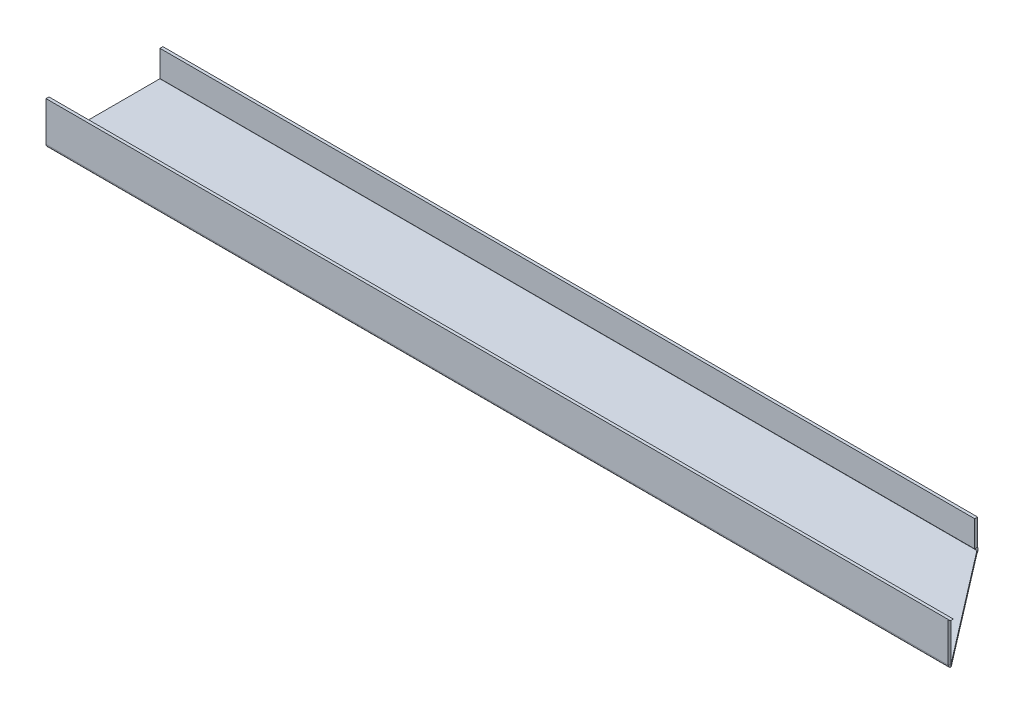
ISO-10303-21;
HEADER;
FILE_DESCRIPTION(('STEP AP214'),'2;1');
FILE_NAME('part.step','',(''),(''),'','','');
FILE_SCHEMA(('AUTOMOTIVE_DESIGN { 1 0 10303 214 1 1 1 1 }'));
ENDSEC;
DATA;
#1=APPLICATION_CONTEXT('core data for automotive mechanical design processes');
#2=APPLICATION_PROTOCOL_DEFINITION('international standard','automotive_design',2000,#1);
#3=PRODUCT_CONTEXT('',#1,'mechanical');
#4=PRODUCT('Part','Part','',(#3));
#5=PRODUCT_RELATED_PRODUCT_CATEGORY('part','',(#4));
#6=PRODUCT_DEFINITION_FORMATION('','',#4);
#7=PRODUCT_DEFINITION_CONTEXT('part definition',#1,'design');
#8=PRODUCT_DEFINITION('design','',#6,#7);
#9=PRODUCT_DEFINITION_SHAPE('','',#8);
#10=(LENGTH_UNIT() NAMED_UNIT(*) SI_UNIT(.MILLI.,.METRE.));
#11=(NAMED_UNIT(*) PLANE_ANGLE_UNIT() SI_UNIT($,.RADIAN.));
#12=(NAMED_UNIT(*) SI_UNIT($,.STERADIAN.) SOLID_ANGLE_UNIT());
#13=UNCERTAINTY_MEASURE_WITH_UNIT(LENGTH_MEASURE(1.E-05),#10,'distance_accuracy_value','');
#14=(GEOMETRIC_REPRESENTATION_CONTEXT(3) GLOBAL_UNCERTAINTY_ASSIGNED_CONTEXT((#13)) GLOBAL_UNIT_ASSIGNED_CONTEXT((#10,
#11,#12)) REPRESENTATION_CONTEXT('',''));
#15=CARTESIAN_POINT('',(0.,0.,0.));
#16=DIRECTION('',(0.,0.,1.));
#17=DIRECTION('',(1.,0.,0.));
#18=AXIS2_PLACEMENT_3D('',#15,#16,#17);
#19=CARTESIAN_POINT('',(115.696300837093,-119.625742003434,-759.253080900733));
#20=DIRECTION('',(-0.148267949866615,0.988947225610321,0.));
#21=DIRECTION('',(0.988947225610321,0.148267949866615,0.));
#22=AXIS2_PLACEMENT_3D('',#19,#20,#21);
#23=PLANE('',#22);
#24=DIRECTION('',(0.988947225610321,0.148267949866615,0.));
#25=VECTOR('',#24,1.);
#26=CARTESIAN_POINT('',(115.696300837093,-119.625742003434,480.));
#27=LINE('',#26,#25);
#28=CARTESIAN_POINT('',(117.498273878021,-119.355581127733,480.));
#29=VERTEX_POINT('',#28);
#30=CARTESIAN_POINT('',(119.0333716916,-119.125431530495,480.));
#31=VERTEX_POINT('',#30);
#32=EDGE_CURVE('E484',#29,#31,#27,.T.);
#33=ORIENTED_EDGE('',*,*,#32,.F.);
#34=DIRECTION('',(0.,0.,1.));
#35=VECTOR('',#34,1.);
#36=CARTESIAN_POINT('',(117.498273878021,-119.355581127733,-759.253080900733));
#37=LINE('',#36,#35);
#38=CARTESIAN_POINT('',(117.498273878021,-119.355581127733,478.));
#39=VERTEX_POINT('',#38);
#40=EDGE_CURVE('E477',#39,#29,#37,.T.);
#41=ORIENTED_EDGE('',*,*,#40,.F.);
#42=DIRECTION('',(-0.988947225610321,-0.148267949866615,0.));
#43=VECTOR('',#42,1.);
#44=CARTESIAN_POINT('',(115.696300837093,-119.625742003434,478.));
#45=LINE('',#44,#43);
#46=CARTESIAN_POINT('',(119.0333716916,-119.125431530495,478.));
#47=VERTEX_POINT('',#46);
#48=EDGE_CURVE('E12',#47,#39,#45,.T.);
#49=ORIENTED_EDGE('',*,*,#48,.F.);
#50=DIRECTION('',(0.,0.,1.));
#51=VECTOR('',#50,1.);
#52=CARTESIAN_POINT('',(119.0333716916,-119.125431530495,-759.253080900733));
#53=LINE('',#52,#51);
#54=EDGE_CURVE('E207',#47,#31,#53,.T.);
#55=ORIENTED_EDGE('',*,*,#54,.T.);
#56=EDGE_LOOP('',(#33,#41,#49,#55));
#57=FACE_BOUND('',#56,.T.);
#58=ADVANCED_FACE('F47',(#57),#23,.F.);
#59=CARTESIAN_POINT('',(120.,-119.125431530495,-759.253080900733));
#60=DIRECTION('',(0.,1.,0.));
#61=DIRECTION('',(0.,0.,1.));
#62=AXIS2_PLACEMENT_3D('',#59,#60,#61);
#63=PLANE('',#62);
#64=DIRECTION('',(0.,0.,1.));
#65=VECTOR('',#64,1.);
#66=CARTESIAN_POINT('',(-500.,-119.125431530495,-759.253080900733));
#67=LINE('',#66,#65);
#68=CARTESIAN_POINT('',(-500.,-119.125431530495,478.));
#69=VERTEX_POINT('',#68);
#70=CARTESIAN_POINT('',(-500.,-119.125431530495,480.));
#71=VERTEX_POINT('',#70);
#72=EDGE_CURVE('E497',#69,#71,#67,.T.);
#73=ORIENTED_EDGE('',*,*,#72,.T.);
#74=DIRECTION('',(-1.,0.,0.));
#75=VECTOR('',#74,1.);
#76=CARTESIAN_POINT('',(120.,-119.125431530495,480.));
#77=LINE('',#76,#75);
#78=EDGE_CURVE('E180',#31,#71,#77,.T.);
#79=ORIENTED_EDGE('',*,*,#78,.F.);
#80=ORIENTED_EDGE('',*,*,#54,.F.);
#81=DIRECTION('',(-1.,0.,0.));
#82=VECTOR('',#81,1.);
#83=CARTESIAN_POINT('',(120.,-119.125431530495,478.));
#84=LINE('',#83,#82);
#85=EDGE_CURVE('E186',#47,#69,#84,.T.);
#86=ORIENTED_EDGE('',*,*,#85,.T.);
#87=EDGE_LOOP('',(#73,#79,#80,#86));
#88=FACE_BOUND('',#87,.T.);
#89=ADVANCED_FACE('F553',(#88),#63,.T.);
#90=CARTESIAN_POINT('',(-500.,-148.331415420023,-759.253080900733));
#91=DIRECTION('',(1.,0.,0.));
#92=DIRECTION('',(0.,-1.,0.));
#93=AXIS2_PLACEMENT_3D('',#90,#91,#92);
#94=PLANE('',#93);
#95=DIRECTION('',(0.,1.,0.));
#96=VECTOR('',#95,1.);
#97=CARTESIAN_POINT('',(-500.,-148.331415420023,480.));
#98=LINE('',#97,#96);
#99=CARTESIAN_POINT('',(-500.,-146.231415420023,480.));
#100=VERTEX_POINT('',#99);
#101=EDGE_CURVE('E172',#100,#71,#98,.T.);
#102=ORIENTED_EDGE('',*,*,#101,.T.);
#103=ORIENTED_EDGE('',*,*,#72,.F.);
#104=DIRECTION('',(0.,1.,0.));
#105=VECTOR('',#104,1.);
#106=CARTESIAN_POINT('',(-500.,-148.331415420023,478.));
#107=LINE('',#106,#105);
#108=CARTESIAN_POINT('',(-500.,-146.231415420023,478.));
#109=VERTEX_POINT('',#108);
#110=EDGE_CURVE('E58',#109,#69,#107,.T.);
#111=ORIENTED_EDGE('',*,*,#110,.F.);
#112=DIRECTION('',(0.,0.,1.));
#113=VECTOR('',#112,1.);
#114=CARTESIAN_POINT('',(-500.,-146.231415420023,-759.253080900733));
#115=LINE('',#114,#113);
#116=EDGE_CURVE('E185',#109,#100,#115,.T.);
#117=ORIENTED_EDGE('',*,*,#116,.T.);
#118=EDGE_LOOP('',(#102,#103,#111,#117));
#119=FACE_BOUND('',#118,.T.);
#120=ADVANCED_FACE('F189',(#119),#94,.F.);
#121=CARTESIAN_POINT('',(120.,-148.331415420023,480.));
#122=DIRECTION('',(0.,0.,1.));
#123=DIRECTION('',(1.,0.,0.));
#124=AXIS2_PLACEMENT_3D('',#121,#122,#123);
#125=PLANE('',#124);
#126=DIRECTION('',(-1.,0.,0.));
#127=VECTOR('',#126,1.);
#128=CARTESIAN_POINT('',(-500.,-146.231415420023,480.));
#129=LINE('',#128,#127);
#130=CARTESIAN_POINT('',(117.498273878021,-146.231415420023,480.));
#131=VERTEX_POINT('',#130);
#132=EDGE_CURVE('E177',#131,#100,#129,.T.);
#133=ORIENTED_EDGE('',*,*,#132,.F.);
#134=DIRECTION('',(0.,1.,0.));
#135=VECTOR('',#134,1.);
#136=CARTESIAN_POINT('',(117.498273878021,-148.331415420023,480.));
#137=LINE('',#136,#135);
#138=EDGE_CURVE('E195',#131,#29,#137,.T.);
#139=ORIENTED_EDGE('',*,*,#138,.T.);
#140=ORIENTED_EDGE('',*,*,#32,.T.);
#141=ORIENTED_EDGE('',*,*,#78,.T.);
#142=ORIENTED_EDGE('',*,*,#101,.F.);
#143=EDGE_LOOP('',(#133,#139,#140,#141,#142));
#144=FACE_BOUND('',#143,.T.);
#145=ADVANCED_FACE('F174',(#144),#125,.T.);
#146=CARTESIAN_POINT('',(117.498273878021,-148.331415420023,-759.253080900733));
#147=DIRECTION('',(-1.,0.,0.));
#148=DIRECTION('',(0.,1.,0.));
#149=AXIS2_PLACEMENT_3D('',#146,#147,#148);
#150=PLANE('',#149);
#151=ORIENTED_EDGE('',*,*,#138,.F.);
#152=DIRECTION('',(0.,0.,1.));
#153=VECTOR('',#152,1.);
#154=CARTESIAN_POINT('',(117.498273878021,-146.231415420023,-759.253080900733));
#155=LINE('',#154,#153);
#156=CARTESIAN_POINT('',(117.498273878021,-146.231415420023,478.));
#157=VERTEX_POINT('',#156);
#158=EDGE_CURVE('E51',#157,#131,#155,.T.);
#159=ORIENTED_EDGE('',*,*,#158,.F.);
#160=DIRECTION('',(0.,-1.,0.));
#161=VECTOR('',#160,1.);
#162=CARTESIAN_POINT('',(117.498273878021,-148.331415420023,478.));
#163=LINE('',#162,#161);
#164=EDGE_CURVE('E88',#39,#157,#163,.T.);
#165=ORIENTED_EDGE('',*,*,#164,.F.);
#166=ORIENTED_EDGE('',*,*,#40,.T.);
#167=EDGE_LOOP('',(#151,#159,#165,#166));
#168=FACE_BOUND('',#167,.T.);
#169=ADVANCED_FACE('F566',(#168),#150,.F.);
#170=CARTESIAN_POINT('',(120.,-148.331415420023,478.));
#171=DIRECTION('',(0.,0.,1.));
#172=DIRECTION('',(1.,0.,0.));
#173=AXIS2_PLACEMENT_3D('',#170,#171,#172);
#174=PLANE('',#173);
#175=ORIENTED_EDGE('',*,*,#164,.T.);
#176=DIRECTION('',(-1.,0.,0.));
#177=VECTOR('',#176,1.);
#178=CARTESIAN_POINT('',(-500.,-146.231415420023,478.));
#179=LINE('',#178,#177);
#180=EDGE_CURVE('E92',#157,#109,#179,.T.);
#181=ORIENTED_EDGE('',*,*,#180,.T.);
#182=ORIENTED_EDGE('',*,*,#110,.T.);
#183=ORIENTED_EDGE('',*,*,#85,.F.);
#184=ORIENTED_EDGE('',*,*,#48,.T.);
#185=EDGE_LOOP('',(#175,#181,#182,#183,#184));
#186=FACE_BOUND('',#185,.T.);
#187=ADVANCED_FACE('F49',(#186),#174,.F.);
#188=CARTESIAN_POINT('',(120.,-128.331415420023,1515.83336338396));
#189=DIRECTION('',(0.,-1.,0.));
#190=DIRECTION('',(0.,0.,-1.));
#191=AXIS2_PLACEMENT_3D('',#188,#189,#190);
#192=PLANE('',#191);
#193=DIRECTION('',(-1.,0.,0.));
#194=VECTOR('',#193,1.);
#195=CARTESIAN_POINT('',(120.,-128.331415420023,400.));
#196=LINE('',#195,#194);
#197=CARTESIAN_POINT('',(57.6294591484467,-128.331415420023,400.));
#198=VERTEX_POINT('',#197);
#199=CARTESIAN_POINT('',(-500.,-128.331415420023,400.));
#200=VERTEX_POINT('',#199);
#201=EDGE_CURVE('E454',#198,#200,#196,.T.);
#202=ORIENTED_EDGE('',*,*,#201,.T.);
#203=DIRECTION('',(0.,0.,-1.));
#204=VECTOR('',#203,1.);
#205=CARTESIAN_POINT('',(-500.,-128.331415420023,1515.83336338396));
#206=LINE('',#205,#204);
#207=CARTESIAN_POINT('',(-500.,-128.331415420023,402.));
#208=VERTEX_POINT('',#207);
#209=EDGE_CURVE('E522',#208,#200,#206,.T.);
#210=ORIENTED_EDGE('',*,*,#209,.F.);
#211=DIRECTION('',(-1.,0.,0.));
#212=VECTOR('',#211,1.);
#213=CARTESIAN_POINT('',(120.,-128.331415420023,402.));
#214=LINE('',#213,#212);
#215=CARTESIAN_POINT('',(57.6294591484467,-128.331415420023,402.));
#216=VERTEX_POINT('',#215);
#217=EDGE_CURVE('E101',#216,#208,#214,.T.);
#218=ORIENTED_EDGE('',*,*,#217,.F.);
#219=DIRECTION('',(0.,0.,-1.));
#220=VECTOR('',#219,1.);
#221=CARTESIAN_POINT('',(57.6294591484467,-128.331415420023,1515.83336338396));
#222=LINE('',#221,#220);
#223=EDGE_CURVE('E349',#216,#198,#222,.T.);
#224=ORIENTED_EDGE('',*,*,#223,.T.);
#225=EDGE_LOOP('',(#202,#210,#218,#224));
#226=FACE_BOUND('',#225,.T.);
#227=ADVANCED_FACE('F534',(#226),#192,.F.);
#228=CARTESIAN_POINT('',(57.6294591484467,-21.6490471035019,1515.83336338396));
#229=DIRECTION('',(1.,0.,0.));
#230=DIRECTION('',(0.,1.,0.));
#231=AXIS2_PLACEMENT_3D('',#228,#229,#230);
#232=PLANE('',#231);
#233=CARTESIAN_POINT('',(57.6294591484467,-146.231415420023,400.));
#234=CARTESIAN_POINT('',(57.6294591484467,-146.231415420023,402.));
#235=B_SPLINE_CURVE_WITH_KNOTS('',1,(#233,#234),.UNSPECIFIED.,.F.,.F.,(2,2),(0.,1.),.UNSPECIFIED.);
#236=CARTESIAN_POINT('',(57.6294591484467,-146.231415420023,402.));
#237=VERTEX_POINT('',#236);
#238=CARTESIAN_POINT('',(57.6294591484467,-146.231415420023,400.));
#239=VERTEX_POINT('',#238);
#240=EDGE_CURVE('E339',#237,#239,#235,.F.);
#241=ORIENTED_EDGE('',*,*,#240,.T.);
#242=DIRECTION('',(0.,-1.,0.));
#243=VECTOR('',#242,1.);
#244=CARTESIAN_POINT('',(57.6294591484467,-21.6490471035019,400.));
#245=LINE('',#244,#243);
#246=EDGE_CURVE('E348',#198,#239,#245,.T.);
#247=ORIENTED_EDGE('',*,*,#246,.F.);
#248=ORIENTED_EDGE('',*,*,#223,.F.);
#249=DIRECTION('',(0.,1.,0.));
#250=VECTOR('',#249,1.);
#251=CARTESIAN_POINT('',(57.6294591484467,-21.6490471035019,402.));
#252=LINE('',#251,#250);
#253=EDGE_CURVE('E516',#237,#216,#252,.T.);
#254=ORIENTED_EDGE('',*,*,#253,.F.);
#255=EDGE_LOOP('',(#241,#247,#248,#254));
#256=FACE_BOUND('',#255,.T.);
#257=ADVANCED_FACE('F550',(#256),#232,.T.);
#258=CARTESIAN_POINT('',(120.,-128.331415420023,400.));
#259=DIRECTION('',(0.,0.,-1.));
#260=DIRECTION('',(-1.,0.,0.));
#261=AXIS2_PLACEMENT_3D('',#258,#259,#260);
#262=PLANE('',#261);
#263=DIRECTION('',(1.,0.,0.));
#264=VECTOR('',#263,1.);
#265=CARTESIAN_POINT('',(57.6294591484467,-146.231415420023,400.));
#266=LINE('',#265,#264);
#267=CARTESIAN_POINT('',(-500.,-146.231415420023,400.));
#268=VERTEX_POINT('',#267);
#269=EDGE_CURVE('E451',#268,#239,#266,.T.);
#270=ORIENTED_EDGE('',*,*,#269,.F.);
#271=DIRECTION('',(0.,-1.,0.));
#272=VECTOR('',#271,1.);
#273=CARTESIAN_POINT('',(-500.,-128.331415420023,400.));
#274=LINE('',#273,#272);
#275=EDGE_CURVE('E462',#200,#268,#274,.T.);
#276=ORIENTED_EDGE('',*,*,#275,.F.);
#277=ORIENTED_EDGE('',*,*,#201,.F.);
#278=ORIENTED_EDGE('',*,*,#246,.T.);
#279=EDGE_LOOP('',(#270,#276,#277,#278));
#280=FACE_BOUND('',#279,.T.);
#281=ADVANCED_FACE('F538',(#280),#262,.T.);
#282=CARTESIAN_POINT('',(-500.,-128.331415420023,1515.83336338396));
#283=DIRECTION('',(1.,0.,0.));
#284=DIRECTION('',(0.,1.,0.));
#285=AXIS2_PLACEMENT_3D('',#282,#283,#284);
#286=PLANE('',#285);
#287=ORIENTED_EDGE('',*,*,#275,.T.);
#288=DIRECTION('',(0.,0.,-1.));
#289=VECTOR('',#288,1.);
#290=CARTESIAN_POINT('',(-500.,-146.231415420023,1515.83336338396));
#291=LINE('',#290,#289);
#292=CARTESIAN_POINT('',(-500.,-146.231415420023,402.));
#293=VERTEX_POINT('',#292);
#294=EDGE_CURVE('E447',#293,#268,#291,.T.);
#295=ORIENTED_EDGE('',*,*,#294,.F.);
#296=DIRECTION('',(0.,1.,0.));
#297=VECTOR('',#296,1.);
#298=CARTESIAN_POINT('',(-500.,-128.331415420023,402.));
#299=LINE('',#298,#297);
#300=EDGE_CURVE('E118',#208,#293,#299,.F.);
#301=ORIENTED_EDGE('',*,*,#300,.F.);
#302=ORIENTED_EDGE('',*,*,#209,.T.);
#303=EDGE_LOOP('',(#287,#295,#301,#302));
#304=FACE_BOUND('',#303,.T.);
#305=ADVANCED_FACE('F540',(#304),#286,.F.);
#306=CARTESIAN_POINT('',(120.,-128.331415420023,402.));
#307=DIRECTION('',(0.,0.,-1.));
#308=DIRECTION('',(-1.,0.,0.));
#309=AXIS2_PLACEMENT_3D('',#306,#307,#308);
#310=PLANE('',#309);
#311=ORIENTED_EDGE('',*,*,#300,.T.);
#312=DIRECTION('',(1.,0.,0.));
#313=VECTOR('',#312,1.);
#314=CARTESIAN_POINT('',(57.6294591484467,-146.231415420023,402.));
#315=LINE('',#314,#313);
#316=EDGE_CURVE('E121',#293,#237,#315,.T.);
#317=ORIENTED_EDGE('',*,*,#316,.T.);
#318=ORIENTED_EDGE('',*,*,#253,.T.);
#319=ORIENTED_EDGE('',*,*,#217,.T.);
#320=EDGE_LOOP('',(#311,#317,#318,#319));
#321=FACE_BOUND('',#320,.T.);
#322=ADVANCED_FACE('F542',(#321),#310,.F.);
#323=CARTESIAN_POINT('',(-500.,1095.78268241608,400.));
#324=DIRECTION('',(1.,0.,0.));
#325=DIRECTION('',(0.,0.,-1.));
#326=AXIS2_PLACEMENT_3D('',#323,#324,#325);
#327=PLANE('',#326);
#328=DIRECTION('',(0.,0.,1.));
#329=VECTOR('',#328,1.);
#330=CARTESIAN_POINT('',(-500.,-148.331415420023,400.));
#331=LINE('',#330,#329);
#332=CARTESIAN_POINT('',(-500.,-148.331415420023,402.1));
#333=VERTEX_POINT('',#332);
#334=CARTESIAN_POINT('',(-500.,-148.331415420023,477.9));
#335=VERTEX_POINT('',#334);
#336=EDGE_CURVE('E242',#333,#335,#331,.T.);
#337=ORIENTED_EDGE('',*,*,#336,.T.);
#338=DIRECTION('',(0.,-1.,0.));
#339=VECTOR('',#338,1.);
#340=CARTESIAN_POINT('',(-500.,1095.78268241608,477.9));
#341=LINE('',#340,#339);
#342=CARTESIAN_POINT('',(-500.,-146.331415420023,477.9));
#343=VERTEX_POINT('',#342);
#344=EDGE_CURVE('E210',#343,#335,#341,.T.);
#345=ORIENTED_EDGE('',*,*,#344,.F.);
#346=DIRECTION('',(0.,0.,1.));
#347=VECTOR('',#346,1.);
#348=CARTESIAN_POINT('',(-500.,-146.331415420023,400.));
#349=LINE('',#348,#347);
#350=CARTESIAN_POINT('',(-500.,-146.331415420023,402.1));
#351=VERTEX_POINT('',#350);
#352=EDGE_CURVE('E262',#351,#343,#349,.T.);
#353=ORIENTED_EDGE('',*,*,#352,.F.);
#354=DIRECTION('',(0.,-1.,0.));
#355=VECTOR('',#354,1.);
#356=CARTESIAN_POINT('',(-500.,1095.78268241608,402.1));
#357=LINE('',#356,#355);
#358=EDGE_CURVE('E138',#351,#333,#357,.T.);
#359=ORIENTED_EDGE('',*,*,#358,.T.);
#360=EDGE_LOOP('',(#337,#345,#353,#359));
#361=FACE_BOUND('',#360,.T.);
#362=ADVANCED_FACE('F548',(#361),#327,.F.);
#363=CARTESIAN_POINT('',(80.7518020082498,1095.78268241608,430.124911462022));
#364=DIRECTION('',(-0.793268311202313,0.,0.608872225054018));
#365=DIRECTION('',(0.608872225054018,0.,0.793268311202313));
#366=AXIS2_PLACEMENT_3D('',#363,#364,#365);
#367=PLANE('',#366);
#368=DIRECTION('',(-0.608872225054018,0.,-0.793268311202313));
#369=VECTOR('',#368,1.);
#370=CARTESIAN_POINT('',(119.0333716916,-148.331415420023,480.));
#371=LINE('',#370,#369);
#372=CARTESIAN_POINT('',(117.421518987342,-148.331415420023,477.9));
#373=VERTEX_POINT('',#372);
#374=CARTESIAN_POINT('',(59.2413118527045,-148.331415420023,402.1));
#375=VERTEX_POINT('',#374);
#376=EDGE_CURVE('E238',#373,#375,#371,.T.);
#377=ORIENTED_EDGE('',*,*,#376,.T.);
#378=CARTESIAN_POINT('',(59.2413118527045,-146.331415420023,402.1));
#379=CARTESIAN_POINT('',(59.2413118527045,-148.331415420023,402.1));
#380=B_SPLINE_CURVE_WITH_KNOTS('',1,(#378,#379),.UNSPECIFIED.,.F.,.F.,(2,2),(0.,1.),.UNSPECIFIED.);
#381=CARTESIAN_POINT('',(59.2413118527045,-146.331415420023,402.1));
#382=VERTEX_POINT('',#381);
#383=EDGE_CURVE('E271',#382,#375,#380,.T.);
#384=ORIENTED_EDGE('',*,*,#383,.F.);
#385=DIRECTION('',(-0.608872225054018,0.,-0.793268311202313));
#386=VECTOR('',#385,1.);
#387=CARTESIAN_POINT('',(80.7518020082498,-146.331415420023,430.124911462022));
#388=LINE('',#387,#386);
#389=CARTESIAN_POINT('',(117.421518987342,-146.331415420023,477.9));
#390=VERTEX_POINT('',#389);
#391=EDGE_CURVE('E268',#390,#382,#388,.T.);
#392=ORIENTED_EDGE('',*,*,#391,.F.);
#393=CARTESIAN_POINT('',(117.421518987342,-148.331415420023,477.9));
#394=CARTESIAN_POINT('',(117.421518987342,-146.331415420023,477.9));
#395=B_SPLINE_CURVE_WITH_KNOTS('',1,(#393,#394),.UNSPECIFIED.,.F.,.F.,(2,2),(0.,1.),.UNSPECIFIED.);
#396=EDGE_CURVE('E129',#390,#373,#395,.F.);
#397=ORIENTED_EDGE('',*,*,#396,.T.);
#398=EDGE_LOOP('',(#377,#384,#392,#397));
#399=FACE_BOUND('',#398,.T.);
#400=ADVANCED_FACE('F616',(#399),#367,.F.);
#401=CARTESIAN_POINT('',(120.,-146.331415420023,400.));
#402=DIRECTION('',(0.,-1.,0.));
#403=DIRECTION('',(0.,0.,-1.));
#404=AXIS2_PLACEMENT_3D('',#401,#402,#403);
#405=PLANE('',#404);
#406=DIRECTION('',(-1.,0.,0.));
#407=VECTOR('',#406,1.);
#408=CARTESIAN_POINT('',(-500.,-146.331415420023,477.9));
#409=LINE('',#408,#407);
#410=EDGE_CURVE('E267',#390,#343,#409,.T.);
#411=ORIENTED_EDGE('',*,*,#410,.F.);
#412=ORIENTED_EDGE('',*,*,#391,.T.);
#413=DIRECTION('',(1.,0.,0.));
#414=VECTOR('',#413,1.);
#415=CARTESIAN_POINT('',(59.2413118527045,-146.331415420023,402.1));
#416=LINE('',#415,#414);
#417=EDGE_CURVE('E274',#351,#382,#416,.T.);
#418=ORIENTED_EDGE('',*,*,#417,.F.);
#419=ORIENTED_EDGE('',*,*,#352,.T.);
#420=EDGE_LOOP('',(#411,#412,#418,#419));
#421=FACE_BOUND('',#420,.T.);
#422=ADVANCED_FACE('F626',(#421),#405,.F.);
#423=CARTESIAN_POINT('',(120.,-148.331415420023,400.));
#424=DIRECTION('',(0.,-1.,0.));
#425=DIRECTION('',(0.,0.,-1.));
#426=AXIS2_PLACEMENT_3D('',#423,#424,#425);
#427=PLANE('',#426);
#428=ORIENTED_EDGE('',*,*,#376,.F.);
#429=DIRECTION('',(-1.,0.,0.));
#430=VECTOR('',#429,1.);
#431=CARTESIAN_POINT('',(-500.,-148.331415420023,477.9));
#432=LINE('',#431,#430);
#433=EDGE_CURVE('E257',#373,#335,#432,.T.);
#434=ORIENTED_EDGE('',*,*,#433,.T.);
#435=ORIENTED_EDGE('',*,*,#336,.F.);
#436=DIRECTION('',(1.,0.,0.));
#437=VECTOR('',#436,1.);
#438=CARTESIAN_POINT('',(59.2413118527045,-148.331415420023,402.1));
#439=LINE('',#438,#437);
#440=EDGE_CURVE('E236',#333,#375,#439,.T.);
#441=ORIENTED_EDGE('',*,*,#440,.T.);
#442=EDGE_LOOP('',(#428,#434,#435,#441));
#443=FACE_BOUND('',#442,.T.);
#444=ADVANCED_FACE('F312',(#443),#427,.T.);
#445=CARTESIAN_POINT('',(57.6294591484467,-146.231415420023,400.));
#446=CARTESIAN_POINT('',(57.7637997570115,-146.506344786225,400.));
#447=CARTESIAN_POINT('',(57.8981012658231,-146.781085977177,400.054657378997));
#448=CARTESIAN_POINT('',(58.1667433831994,-147.289015278802,400.265048584456));
#449=CARTESIAN_POINT('',(58.3010644418875,-147.52196353197,400.420699630964));
#450=CARTESIAN_POINT('',(58.5697065592639,-147.910715789059,400.809451888053));
#451=CARTESIAN_POINT('',(58.704027617952,-148.066366835567,401.042400141221));
#452=CARTESIAN_POINT('',(58.9726697353283,-148.276758041027,401.550329442846));
#453=CARTESIAN_POINT('',(59.1069712441397,-148.331415420023,401.825070633798));
#454=CARTESIAN_POINT('',(59.2413118527045,-148.331415420023,402.1));
#455=CARTESIAN_POINT('',(57.6294591484467,-146.231415420023,402.));
#456=CARTESIAN_POINT('',(57.7637804349682,-146.244505411616,402.));
#457=CARTESIAN_POINT('',(57.8981012658231,-146.257590208459,402.002602732333));
#458=CARTESIAN_POINT('',(58.1667433831994,-146.28177731806,402.012621361165));
#459=CARTESIAN_POINT('',(58.3010644418875,-146.292870092021,402.02003331576));
#460=CARTESIAN_POINT('',(58.5697065592639,-146.311382104263,402.038545328003));
#461=CARTESIAN_POINT('',(58.704027617952,-146.318794058859,402.049638101963));
#462=CARTESIAN_POINT('',(58.9726697353283,-146.32881268769,402.073825211564));
#463=CARTESIAN_POINT('',(59.106990566183,-146.331415420023,402.086910008407));
#464=CARTESIAN_POINT('',(59.2413118527045,-146.331415420023,402.1));
#465=B_SPLINE_SURFACE_WITH_KNOTS('',1,3,((#445,#446,#447,#448,#449,#450,#451,#452,#453,#454),
(#455,#456,#457,#458,#459,#460,#461,#462,#463,#464)),.UNSPECIFIED.,.F.,.F.,.F.,(2,2),(4,2,2,2,
4),(0.,1.),(0.,0.25,0.5,0.75,1.),.UNSPECIFIED.);
#466=CARTESIAN_POINT('',(57.6294591484467,-146.231415420023,402.));
#467=CARTESIAN_POINT('',(57.7637804349682,-146.244505411616,402.));
#468=CARTESIAN_POINT('',(57.8981012658231,-146.257590208459,402.002602732333));
#469=CARTESIAN_POINT('',(58.1667433831994,-146.28177731806,402.012621361165));
#470=CARTESIAN_POINT('',(58.3010644418875,-146.292870092021,402.02003331576));
#471=CARTESIAN_POINT('',(58.5697065592639,-146.311382104263,402.038545328003));
#472=CARTESIAN_POINT('',(58.704027617952,-146.318794058859,402.049638101963));
#473=CARTESIAN_POINT('',(58.9726697353283,-146.32881268769,402.073825211564));
#474=CARTESIAN_POINT('',(59.106990566183,-146.331415420023,402.086910008407));
#475=CARTESIAN_POINT('',(59.2413118527045,-146.331415420023,402.1));
#476=B_SPLINE_CURVE_WITH_KNOTS('',3,(#466,#467,#468,#469,#470,#471,#472,#473,#474,#475),
.UNSPECIFIED.,.F.,.F.,(4,2,2,2,4),(0.,0.25,0.5,0.75,1.),.UNSPECIFIED.);
#477=EDGE_CURVE('E341',#237,#382,#476,.T.);
#478=CARTESIAN_POINT('',(59.2413118527045,-148.331415420023,402.1));
#479=CARTESIAN_POINT('',(59.1069712441397,-148.331415420023,401.825070633798));
#480=CARTESIAN_POINT('',(58.9726697353283,-148.276758041027,401.550329442846));
#481=CARTESIAN_POINT('',(58.704027617952,-148.066366835567,401.042400141221));
#482=CARTESIAN_POINT('',(58.5697065592639,-147.910715789059,400.809451888053));
#483=CARTESIAN_POINT('',(58.3010644418875,-147.52196353197,400.420699630964));
#484=CARTESIAN_POINT('',(58.1667433831994,-147.289015278802,400.265048584456));
#485=CARTESIAN_POINT('',(57.8981012658231,-146.781085977177,400.054657378997));
#486=CARTESIAN_POINT('',(57.7637997570115,-146.506344786225,400.));
#487=CARTESIAN_POINT('',(57.6294591484467,-146.231415420023,400.));
#488=B_SPLINE_CURVE_WITH_KNOTS('',3,(#478,#479,#480,#481,#482,#483,#484,#485,#486,#487),
.UNSPECIFIED.,.F.,.F.,(4,2,2,2,4),(0.,0.25,0.5,0.75,1.),.UNSPECIFIED.);
#489=EDGE_CURVE('E343',#239,#375,#488,.F.);
#490=ORIENTED_EDGE('',*,*,#240,.F.);
#491=ORIENTED_EDGE('',*,*,#477,.T.);
#492=ORIENTED_EDGE('',*,*,#383,.T.);
#493=ORIENTED_EDGE('',*,*,#489,.F.);
#494=EDGE_LOOP('',(#490,#491,#492,#493));
#495=FACE_BOUND('',#494,.T.);
#496=ADVANCED_FACE('F299',(#495),#465,.T.);
#497=CARTESIAN_POINT('',(-500.,-146.231415420023,402.1));
#498=DIRECTION('',(-1.,0.,0.));
#499=DIRECTION('',(0.,0.,1.));
#500=AXIS2_PLACEMENT_3D('',#497,#498,#499);
#501=PLANE('',#500);
#502=CARTESIAN_POINT('',(-500.,-146.231415420023,402.1));
#503=DIRECTION('',(-1.,0.,0.));
#504=DIRECTION('',(0.,0.,1.));
#505=AXIS2_PLACEMENT_3D('',#502,#503,#504);
#506=CIRCLE('',#505,0.100000000000008);
#507=EDGE_CURVE('E355',#351,#293,#506,.F.);
#508=ORIENTED_EDGE('',*,*,#507,.T.);
#509=ORIENTED_EDGE('',*,*,#294,.T.);
#510=CARTESIAN_POINT('',(-500.,-146.231415420023,402.1));
#511=DIRECTION('',(-1.,0.,0.));
#512=DIRECTION('',(0.,0.,1.));
#513=AXIS2_PLACEMENT_3D('',#510,#511,#512);
#514=CIRCLE('',#513,2.10000000000001);
#515=EDGE_CURVE('E243',#333,#268,#514,.F.);
#516=ORIENTED_EDGE('',*,*,#515,.F.);
#517=ORIENTED_EDGE('',*,*,#358,.F.);
#518=EDGE_LOOP('',(#508,#509,#516,#517));
#519=FACE_BOUND('',#518,.T.);
#520=ADVANCED_FACE('F311',(#519),#501,.T.);
#521=CARTESIAN_POINT('',(690.187171580419,-146.231415420023,402.1));
#522=DIRECTION('',(-1.,0.,0.));
#523=DIRECTION('',(0.,0.,1.));
#524=AXIS2_PLACEMENT_3D('',#521,#522,#523);
#525=CYLINDRICAL_SURFACE('',#524,2.10000000000001);
#526=ORIENTED_EDGE('',*,*,#440,.F.);
#527=ORIENTED_EDGE('',*,*,#515,.T.);
#528=ORIENTED_EDGE('',*,*,#269,.T.);
#529=ORIENTED_EDGE('',*,*,#489,.T.);
#530=EDGE_LOOP('',(#526,#527,#528,#529));
#531=FACE_BOUND('',#530,.T.);
#532=ADVANCED_FACE('F374',(#531),#525,.T.);
#533=CARTESIAN_POINT('',(690.187171580419,-146.231415420023,402.1));
#534=DIRECTION('',(-1.,0.,0.));
#535=DIRECTION('',(0.,0.,1.));
#536=AXIS2_PLACEMENT_3D('',#533,#534,#535);
#537=CYLINDRICAL_SURFACE('',#536,0.100000000000008);
#538=ORIENTED_EDGE('',*,*,#417,.T.);
#539=ORIENTED_EDGE('',*,*,#477,.F.);
#540=ORIENTED_EDGE('',*,*,#316,.F.);
#541=ORIENTED_EDGE('',*,*,#507,.F.);
#542=EDGE_LOOP('',(#538,#539,#540,#541));
#543=FACE_BOUND('',#542,.T.);
#544=ADVANCED_FACE('F314',(#543),#537,.F.);
#545=CARTESIAN_POINT('',(117.498273878021,-146.231415420023,477.9));
#546=DIRECTION('',(1.,0.,0.));
#547=DIRECTION('',(0.,0.,-1.));
#548=AXIS2_PLACEMENT_3D('',#545,#546,#547);
#549=PLANE('',#548);
#550=CARTESIAN_POINT('',(117.498273878021,-146.329493948063,477.919509032202));
#551=CARTESIAN_POINT('',(117.498273878021,-148.29106450887,478.309689676234));
#552=B_SPLINE_CURVE_WITH_KNOTS('',1,(#550,#551),.UNSPECIFIED.,.F.,.F.,(2,2),(0.,1.),.UNSPECIFIED.);
#553=CARTESIAN_POINT('',(117.498273878021,-146.329493948063,477.919509032202));
#554=VERTEX_POINT('',#553);
#555=CARTESIAN_POINT('',(117.498273878021,-148.29106450887,478.309689676234));
#556=VERTEX_POINT('',#555);
#557=EDGE_CURVE('E356',#554,#556,#552,.T.);
#558=ORIENTED_EDGE('',*,*,#557,.F.);
#559=CARTESIAN_POINT('',(117.498273878021,-146.231415420023,477.9));
#560=DIRECTION('',(1.,0.,0.));
#561=DIRECTION('',(0.,0.,-1.));
#562=AXIS2_PLACEMENT_3D('',#559,#560,#561);
#563=CIRCLE('',#562,0.0999999999999858);
#564=EDGE_CURVE('E219',#554,#157,#563,.F.);
#565=ORIENTED_EDGE('',*,*,#564,.T.);
#566=ORIENTED_EDGE('',*,*,#158,.T.);
#567=CARTESIAN_POINT('',(117.498273878021,-146.231415420023,477.9));
#568=DIRECTION('',(1.,0.,0.));
#569=DIRECTION('',(0.,0.,-1.));
#570=AXIS2_PLACEMENT_3D('',#567,#568,#569);
#571=CIRCLE('',#570,2.09999999999999);
#572=EDGE_CURVE('E205',#556,#131,#571,.F.);
#573=ORIENTED_EDGE('',*,*,#572,.F.);
#574=EDGE_LOOP('',(#558,#565,#566,#573));
#575=FACE_BOUND('',#574,.T.);
#576=ADVANCED_FACE('F390',(#575),#549,.T.);
#577=CARTESIAN_POINT('',(-500.,-146.231415420023,477.9));
#578=DIRECTION('',(-1.,0.,0.));
#579=DIRECTION('',(0.,0.,1.));
#580=AXIS2_PLACEMENT_3D('',#577,#578,#579);
#581=PLANE('',#580);
#582=ORIENTED_EDGE('',*,*,#116,.F.);
#583=CARTESIAN_POINT('',(-500.,-146.231415420023,477.9));
#584=DIRECTION('',(1.,0.,0.));
#585=DIRECTION('',(0.,0.,-1.));
#586=AXIS2_PLACEMENT_3D('',#583,#584,#585);
#587=CIRCLE('',#586,0.0999999999999858);
#588=EDGE_CURVE('E222',#109,#343,#587,.T.);
#589=ORIENTED_EDGE('',*,*,#588,.T.);
#590=ORIENTED_EDGE('',*,*,#344,.T.);
#591=CARTESIAN_POINT('',(-500.,-146.231415420023,477.9));
#592=DIRECTION('',(1.,0.,0.));
#593=DIRECTION('',(0.,0.,-1.));
#594=AXIS2_PLACEMENT_3D('',#591,#592,#593);
#595=CIRCLE('',#594,2.09999999999999);
#596=EDGE_CURVE('E202',#100,#335,#595,.T.);
#597=ORIENTED_EDGE('',*,*,#596,.F.);
#598=EDGE_LOOP('',(#582,#589,#590,#597));
#599=FACE_BOUND('',#598,.T.);
#600=ADVANCED_FACE('F209',(#599),#581,.T.);
#601=CARTESIAN_POINT('',(117.421518987342,-148.331415420023,477.9));
#602=CARTESIAN_POINT('',(117.447105017906,-148.331415420023,478.037450410634));
#603=CARTESIAN_POINT('',(117.472687847457,-148.317879753742,478.174880336698));
#604=CARTESIAN_POINT('',(117.498273878021,-148.29106450887,478.309689676234));
#605=CARTESIAN_POINT('',(117.421518987342,-146.331415420023,477.9));
#606=CARTESIAN_POINT('',(117.447104022254,-146.331415420023,477.906545002948));
#607=CARTESIAN_POINT('',(117.472688843109,-146.330770814796,477.91308978965));
#608=CARTESIAN_POINT('',(117.498273878021,-146.329493948063,477.919509032202));
#609=B_SPLINE_SURFACE_WITH_KNOTS('',1,3,((#601,#602,#603,#604),(#605,#606,#607,#608)),
.UNSPECIFIED.,.F.,.F.,.F.,(2,2),(4,4),(0.,1.),(0.,1.),.UNSPECIFIED.);
#610=CARTESIAN_POINT('',(117.421518987342,-146.331415420023,477.9));
#611=CARTESIAN_POINT('',(117.447104022254,-146.331415420023,477.906545002948));
#612=CARTESIAN_POINT('',(117.472688843109,-146.330770814796,477.91308978965));
#613=CARTESIAN_POINT('',(117.498273878021,-146.329493948063,477.919509032202));
#614=B_SPLINE_CURVE_WITH_KNOTS('',3,(#610,#611,#612,#613),.UNSPECIFIED.,.F.,.F.,(4,4),(0.,1.),.UNSPECIFIED.);
#615=EDGE_CURVE('E212',#390,#554,#614,.T.);
#616=CARTESIAN_POINT('',(117.498273878021,-148.29106450887,478.309689676234));
#617=CARTESIAN_POINT('',(117.472687847457,-148.317879753742,478.174880336698));
#618=CARTESIAN_POINT('',(117.447105017906,-148.331415420023,478.037450410634));
#619=CARTESIAN_POINT('',(117.421518987342,-148.331415420023,477.9));
#620=B_SPLINE_CURVE_WITH_KNOTS('',3,(#616,#617,#618,#619),.UNSPECIFIED.,.F.,.F.,(4,4),(0.,1.),.UNSPECIFIED.);
#621=EDGE_CURVE('E216',#373,#556,#620,.F.);
#622=ORIENTED_EDGE('',*,*,#615,.T.);
#623=ORIENTED_EDGE('',*,*,#557,.T.);
#624=ORIENTED_EDGE('',*,*,#621,.F.);
#625=ORIENTED_EDGE('',*,*,#396,.F.);
#626=EDGE_LOOP('',(#622,#623,#624,#625));
#627=FACE_BOUND('',#626,.T.);
#628=ADVANCED_FACE('F383',(#627),#609,.T.);
#629=CARTESIAN_POINT('',(-1128.32994345906,-146.231415420023,477.9));
#630=DIRECTION('',(1.,0.,0.));
#631=DIRECTION('',(0.,0.,-1.));
#632=AXIS2_PLACEMENT_3D('',#629,#630,#631);
#633=CYLINDRICAL_SURFACE('',#632,2.09999999999999);
#634=ORIENTED_EDGE('',*,*,#433,.F.);
#635=ORIENTED_EDGE('',*,*,#621,.T.);
#636=ORIENTED_EDGE('',*,*,#572,.T.);
#637=ORIENTED_EDGE('',*,*,#132,.T.);
#638=ORIENTED_EDGE('',*,*,#596,.T.);
#639=EDGE_LOOP('',(#634,#635,#636,#637,#638));
#640=FACE_BOUND('',#639,.T.);
#641=ADVANCED_FACE('F201',(#640),#633,.T.);
#642=CARTESIAN_POINT('',(-1128.32994345906,-146.231415420023,477.9));
#643=DIRECTION('',(1.,0.,0.));
#644=DIRECTION('',(0.,0.,-1.));
#645=AXIS2_PLACEMENT_3D('',#642,#643,#644);
#646=CYLINDRICAL_SURFACE('',#645,0.0999999999999858);
#647=ORIENTED_EDGE('',*,*,#410,.T.);
#648=ORIENTED_EDGE('',*,*,#588,.F.);
#649=ORIENTED_EDGE('',*,*,#180,.F.);
#650=ORIENTED_EDGE('',*,*,#564,.F.);
#651=ORIENTED_EDGE('',*,*,#615,.F.);
#652=EDGE_LOOP('',(#647,#648,#649,#650,#651));
#653=FACE_BOUND('',#652,.T.);
#654=ADVANCED_FACE('F576',(#653),#646,.F.);
#655=CLOSED_SHELL('',(#58,#89,#120,#145,#169,#187,#227,#257,#281,#305,#322,#362,#400,#422,#444,
#496,#520,#532,#544,#576,#600,#628,#641,#654));
#656=MANIFOLD_SOLID_BREP('B2',#655);
#657=ADVANCED_BREP_SHAPE_REPRESENTATION('',(#18,#656),#14);
#658=SHAPE_DEFINITION_REPRESENTATION(#9,#657);
ENDSEC;
END-ISO-10303-21;
